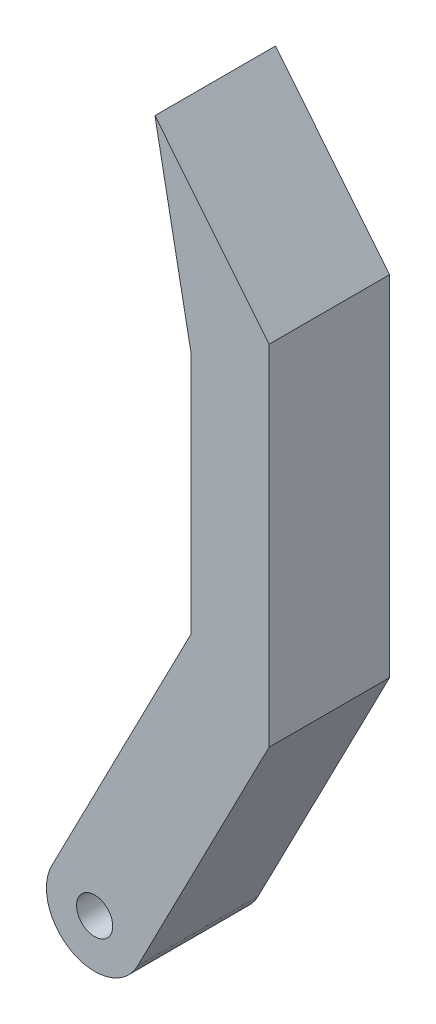
ISO-10303-21;
HEADER;
FILE_DESCRIPTION(('STEP AP214'),'2;1');
FILE_NAME('part.step','',(''),(''),'','','');
FILE_SCHEMA(('AUTOMOTIVE_DESIGN { 1 0 10303 214 1 1 1 1 }'));
ENDSEC;
DATA;
#1=APPLICATION_CONTEXT('core data for automotive mechanical design processes');
#2=APPLICATION_PROTOCOL_DEFINITION('international standard','automotive_design',2000,#1);
#3=PRODUCT_CONTEXT('',#1,'mechanical');
#4=PRODUCT('Part','Part','',(#3));
#5=PRODUCT_RELATED_PRODUCT_CATEGORY('part','',(#4));
#6=PRODUCT_DEFINITION_FORMATION('','',#4);
#7=PRODUCT_DEFINITION_CONTEXT('part definition',#1,'design');
#8=PRODUCT_DEFINITION('design','',#6,#7);
#9=PRODUCT_DEFINITION_SHAPE('','',#8);
#10=(LENGTH_UNIT() NAMED_UNIT(*) SI_UNIT(.MILLI.,.METRE.));
#11=(NAMED_UNIT(*) PLANE_ANGLE_UNIT() SI_UNIT($,.RADIAN.));
#12=(NAMED_UNIT(*) SI_UNIT($,.STERADIAN.) SOLID_ANGLE_UNIT());
#13=UNCERTAINTY_MEASURE_WITH_UNIT(LENGTH_MEASURE(1.E-05),#10,'distance_accuracy_value','');
#14=(GEOMETRIC_REPRESENTATION_CONTEXT(3) GLOBAL_UNCERTAINTY_ASSIGNED_CONTEXT((#13)) GLOBAL_UNIT_ASSIGNED_CONTEXT((#10,
#11,#12)) REPRESENTATION_CONTEXT('',''));
#15=CARTESIAN_POINT('',(0.,0.,0.));
#16=DIRECTION('',(0.,0.,1.));
#17=DIRECTION('',(1.,0.,0.));
#18=AXIS2_PLACEMENT_3D('',#15,#16,#17);
#19=CARTESIAN_POINT('',(-3.55542903671762,1.83273685095957,10.));
#20=DIRECTION('',(-0.888857259179405,0.458184212739893,0.));
#21=DIRECTION('',(-0.458184212739893,-0.888857259179405,0.));
#22=AXIS2_PLACEMENT_3D('',#19,#20,#21);
#23=PLANE('',#22);
#24=DIRECTION('',(0.458184212739893,0.888857259179405,0.));
#25=VECTOR('',#24,1.);
#26=CARTESIAN_POINT('',(-3.55542903671762,1.83273685095957,0.));
#27=LINE('',#26,#25);
#28=CARTESIAN_POINT('',(-3.55542903671762,1.83273685095957,0.));
#29=VERTEX_POINT('',#28);
#30=CARTESIAN_POINT('',(8.00000000000001,24.2497619177961,0.));
#31=VERTEX_POINT('',#30);
#32=EDGE_CURVE('E129',#29,#31,#27,.T.);
#33=ORIENTED_EDGE('',*,*,#32,.F.);
#34=DIRECTION('',(0.,0.,-1.));
#35=VECTOR('',#34,1.);
#36=CARTESIAN_POINT('',(-3.55542903671762,1.83273685095957,10.));
#37=LINE('',#36,#35);
#38=CARTESIAN_POINT('',(-3.55542903671762,1.83273685095957,10.));
#39=VERTEX_POINT('',#38);
#40=EDGE_CURVE('E11',#39,#29,#37,.T.);
#41=ORIENTED_EDGE('',*,*,#40,.F.);
#42=DIRECTION('',(0.458184212739893,0.888857259179405,0.));
#43=VECTOR('',#42,1.);
#44=CARTESIAN_POINT('',(-3.55542903671762,1.83273685095957,10.));
#45=LINE('',#44,#43);
#46=CARTESIAN_POINT('',(8.00000000000001,24.2497619177961,10.));
#47=VERTEX_POINT('',#46);
#48=EDGE_CURVE('E178',#39,#47,#45,.T.);
#49=ORIENTED_EDGE('',*,*,#48,.T.);
#50=DIRECTION('',(0.,0.,-1.));
#51=VECTOR('',#50,1.);
#52=CARTESIAN_POINT('',(8.00000000000001,24.2497619177961,10.));
#53=LINE('',#52,#51);
#54=EDGE_CURVE('E49',#47,#31,#53,.T.);
#55=ORIENTED_EDGE('',*,*,#54,.T.);
#56=EDGE_LOOP('',(#33,#41,#49,#55));
#57=FACE_BOUND('',#56,.T.);
#58=ADVANCED_FACE('F32',(#57),#23,.T.);
#59=CARTESIAN_POINT('',(0.,0.,10.));
#60=DIRECTION('',(0.,0.,-1.));
#61=DIRECTION('',(-1.,0.,0.));
#62=AXIS2_PLACEMENT_3D('',#59,#60,#61);
#63=CYLINDRICAL_SURFACE('',#62,4.);
#64=CARTESIAN_POINT('',(0.,0.,0.));
#65=DIRECTION('',(0.,0.,1.));
#66=DIRECTION('',(1.,0.,0.));
#67=AXIS2_PLACEMENT_3D('',#64,#65,#66);
#68=CIRCLE('',#67,4.);
#69=CARTESIAN_POINT('',(3.55542903671762,-1.83273685095957,0.));
#70=VERTEX_POINT('',#69);
#71=EDGE_CURVE('E131',#29,#70,#68,.T.);
#72=ORIENTED_EDGE('',*,*,#71,.T.);
#73=DIRECTION('',(0.,0.,-1.));
#74=VECTOR('',#73,1.);
#75=CARTESIAN_POINT('',(3.55542903671762,-1.83273685095957,10.));
#76=LINE('',#75,#74);
#77=CARTESIAN_POINT('',(3.55542903671762,-1.83273685095957,10.));
#78=VERTEX_POINT('',#77);
#79=EDGE_CURVE('E41',#78,#70,#76,.T.);
#80=ORIENTED_EDGE('',*,*,#79,.F.);
#81=CARTESIAN_POINT('',(0.,0.,10.));
#82=DIRECTION('',(0.,0.,1.));
#83=DIRECTION('',(1.,0.,0.));
#84=AXIS2_PLACEMENT_3D('',#81,#82,#83);
#85=CIRCLE('',#84,4.);
#86=EDGE_CURVE('E176',#39,#78,#85,.T.);
#87=ORIENTED_EDGE('',*,*,#86,.F.);
#88=ORIENTED_EDGE('',*,*,#40,.T.);
#89=EDGE_LOOP('',(#72,#80,#87,#88));
#90=FACE_BOUND('',#89,.T.);
#91=ADVANCED_FACE('F166',(#90),#63,.T.);
#92=CARTESIAN_POINT('',(-2.11422894103003E-13,-4.10151133441408E-13,10.));
#93=DIRECTION('',(0.458184212739791,0.888857259179458,0.));
#94=DIRECTION('',(-0.888857259179458,0.458184212739791,0.));
#95=AXIS2_PLACEMENT_3D('',#92,#93,#94);
#96=PLANE('',#95);
#97=DIRECTION('',(0.888857259179458,-0.458184212739791,0.));
#98=VECTOR('',#97,1.);
#99=CARTESIAN_POINT('',(-2.11422894103003E-13,-4.10151133441408E-13,0.));
#100=LINE('',#99,#98);
#101=CARTESIAN_POINT('',(3.55462102571887,-1.83232034101996,0.));
#102=VERTEX_POINT('',#101);
#103=EDGE_CURVE('E134',#102,#70,#100,.T.);
#104=ORIENTED_EDGE('',*,*,#103,.F.);
#105=DIRECTION('',(0.,0.,-1.));
#106=VECTOR('',#105,1.);
#107=CARTESIAN_POINT('',(3.55462102571887,-1.83232034101996,10.));
#108=LINE('',#107,#106);
#109=CARTESIAN_POINT('',(3.55462102571887,-1.83232034101996,10.));
#110=VERTEX_POINT('',#109);
#111=EDGE_CURVE('E156',#110,#102,#108,.T.);
#112=ORIENTED_EDGE('',*,*,#111,.F.);
#113=DIRECTION('',(0.888857259179458,-0.458184212739791,0.));
#114=VECTOR('',#113,1.);
#115=CARTESIAN_POINT('',(-2.11422894103003E-13,-4.10151133441408E-13,10.));
#116=LINE('',#115,#114);
#117=EDGE_CURVE('E163',#110,#78,#116,.T.);
#118=ORIENTED_EDGE('',*,*,#117,.T.);
#119=ORIENTED_EDGE('',*,*,#79,.T.);
#120=EDGE_LOOP('',(#104,#112,#118,#119));
#121=FACE_BOUND('',#120,.T.);
#122=ADVANCED_FACE('F161',(#121),#96,.T.);
#123=CARTESIAN_POINT('',(3.55462102571887,-1.83232034101996,10.));
#124=DIRECTION('',(-0.888857259179405,0.458184212739893,0.));
#125=DIRECTION('',(-0.458184212739893,-0.888857259179405,0.));
#126=AXIS2_PLACEMENT_3D('',#123,#124,#125);
#127=PLANE('',#126);
#128=DIRECTION('',(0.458184212739893,0.888857259179405,0.));
#129=VECTOR('',#128,1.);
#130=CARTESIAN_POINT('',(3.55462102571887,-1.83232034101996,0.));
#131=LINE('',#130,#129);
#132=CARTESIAN_POINT('',(14.47,19.3430357018385,0.));
#133=VERTEX_POINT('',#132);
#134=EDGE_CURVE('E137',#102,#133,#131,.T.);
#135=ORIENTED_EDGE('',*,*,#134,.T.);
#136=DIRECTION('',(0.,0.,-1.));
#137=VECTOR('',#136,1.);
#138=CARTESIAN_POINT('',(14.47,19.3430357018385,10.));
#139=LINE('',#138,#137);
#140=CARTESIAN_POINT('',(14.47,19.3430357018385,10.));
#141=VERTEX_POINT('',#140);
#142=EDGE_CURVE('E153',#141,#133,#139,.T.);
#143=ORIENTED_EDGE('',*,*,#142,.F.);
#144=DIRECTION('',(0.458184212739893,0.888857259179405,0.));
#145=VECTOR('',#144,1.);
#146=CARTESIAN_POINT('',(3.55462102571887,-1.83232034101996,10.));
#147=LINE('',#146,#145);
#148=EDGE_CURVE('E174',#110,#141,#147,.T.);
#149=ORIENTED_EDGE('',*,*,#148,.F.);
#150=ORIENTED_EDGE('',*,*,#111,.T.);
#151=EDGE_LOOP('',(#135,#143,#149,#150));
#152=FACE_BOUND('',#151,.T.);
#153=ADVANCED_FACE('F172',(#152),#127,.F.);
#154=CARTESIAN_POINT('',(14.47,0.,10.));
#155=DIRECTION('',(-1.,0.,0.));
#156=DIRECTION('',(0.,0.,1.));
#157=AXIS2_PLACEMENT_3D('',#154,#155,#156);
#158=PLANE('',#157);
#159=DIRECTION('',(0.,1.,0.));
#160=VECTOR('',#159,1.);
#161=CARTESIAN_POINT('',(14.47,0.,0.));
#162=LINE('',#161,#160);
#163=CARTESIAN_POINT('',(14.47,48.3030357018385,0.));
#164=VERTEX_POINT('',#163);
#165=EDGE_CURVE('E140',#133,#164,#162,.T.);
#166=ORIENTED_EDGE('',*,*,#165,.T.);
#167=DIRECTION('',(0.,0.,-1.));
#168=VECTOR('',#167,1.);
#169=CARTESIAN_POINT('',(14.47,48.3030357018385,10.));
#170=LINE('',#169,#168);
#171=CARTESIAN_POINT('',(14.47,48.3030357018385,10.));
#172=VERTEX_POINT('',#171);
#173=EDGE_CURVE('E118',#172,#164,#170,.T.);
#174=ORIENTED_EDGE('',*,*,#173,.F.);
#175=DIRECTION('',(0.,1.,0.));
#176=VECTOR('',#175,1.);
#177=CARTESIAN_POINT('',(14.47,0.,10.));
#178=LINE('',#177,#176);
#179=EDGE_CURVE('E107',#141,#172,#178,.T.);
#180=ORIENTED_EDGE('',*,*,#179,.F.);
#181=ORIENTED_EDGE('',*,*,#142,.T.);
#182=EDGE_LOOP('',(#166,#174,#180,#181));
#183=FACE_BOUND('',#182,.T.);
#184=ADVANCED_FACE('F207',(#183),#158,.F.);
#185=CARTESIAN_POINT('',(32.364419219536,26.1894896839153,10.));
#186=DIRECTION('',(-0.777365588363543,-0.62904907759904,0.));
#187=DIRECTION('',(0.62904907759904,-0.777365588363543,0.));
#188=AXIS2_PLACEMENT_3D('',#185,#186,#187);
#189=PLANE('',#188);
#190=DIRECTION('',(-0.62904907759904,0.777365588363543,0.));
#191=VECTOR('',#190,1.);
#192=CARTESIAN_POINT('',(32.364419219536,26.1894896839153,0.));
#193=LINE('',#192,#191);
#194=CARTESIAN_POINT('',(5.00281138213446,60.0023878067098,0.));
#195=VERTEX_POINT('',#194);
#196=EDGE_CURVE('E115',#164,#195,#193,.T.);
#197=ORIENTED_EDGE('',*,*,#196,.T.);
#198=DIRECTION('',(0.,0.,-1.));
#199=VECTOR('',#198,1.);
#200=CARTESIAN_POINT('',(5.00281138213446,60.0023878067098,10.));
#201=LINE('',#200,#199);
#202=CARTESIAN_POINT('',(5.00281138213446,60.0023878067098,10.));
#203=VERTEX_POINT('',#202);
#204=EDGE_CURVE('E113',#203,#195,#201,.T.);
#205=ORIENTED_EDGE('',*,*,#204,.F.);
#206=DIRECTION('',(-0.62904907759904,0.777365588363543,0.));
#207=VECTOR('',#206,1.);
#208=CARTESIAN_POINT('',(32.364419219536,26.1894896839153,10.));
#209=LINE('',#208,#207);
#210=EDGE_CURVE('E99',#172,#203,#209,.T.);
#211=ORIENTED_EDGE('',*,*,#210,.F.);
#212=ORIENTED_EDGE('',*,*,#173,.T.);
#213=EDGE_LOOP('',(#197,#205,#211,#212));
#214=FACE_BOUND('',#213,.T.);
#215=ADVANCED_FACE('F114',(#214),#189,.F.);
#216=CARTESIAN_POINT('',(15.9566100874892,3.07005689229448,10.));
#217=DIRECTION('',(-0.981989574634544,-0.18893510872537,0.));
#218=DIRECTION('',(0.18893510872537,-0.981989574634544,0.));
#219=AXIS2_PLACEMENT_3D('',#216,#217,#218);
#220=PLANE('',#219);
#221=DIRECTION('',(-0.18893510872537,0.981989574634544,0.));
#222=VECTOR('',#221,1.);
#223=CARTESIAN_POINT('',(15.9566100874892,3.07005689229448,0.));
#224=LINE('',#223,#222);
#225=CARTESIAN_POINT('',(8.,44.4245103237299,0.));
#226=VERTEX_POINT('',#225);
#227=EDGE_CURVE('E144',#226,#195,#224,.T.);
#228=ORIENTED_EDGE('',*,*,#227,.F.);
#229=DIRECTION('',(0.,0.,-1.));
#230=VECTOR('',#229,1.);
#231=CARTESIAN_POINT('',(8.,44.4245103237299,10.));
#232=LINE('',#231,#230);
#233=CARTESIAN_POINT('',(8.,44.4245103237299,10.));
#234=VERTEX_POINT('',#233);
#235=EDGE_CURVE('E74',#234,#226,#232,.T.);
#236=ORIENTED_EDGE('',*,*,#235,.F.);
#237=DIRECTION('',(-0.18893510872537,0.981989574634544,0.));
#238=VECTOR('',#237,1.);
#239=CARTESIAN_POINT('',(15.9566100874892,3.07005689229448,10.));
#240=LINE('',#239,#238);
#241=EDGE_CURVE('E105',#234,#203,#240,.T.);
#242=ORIENTED_EDGE('',*,*,#241,.T.);
#243=ORIENTED_EDGE('',*,*,#204,.T.);
#244=EDGE_LOOP('',(#228,#236,#242,#243));
#245=FACE_BOUND('',#244,.T.);
#246=ADVANCED_FACE('F120',(#245),#220,.T.);
#247=CARTESIAN_POINT('',(0.,0.,10.));
#248=DIRECTION('',(0.,0.,-1.));
#249=DIRECTION('',(-1.,0.,0.));
#250=AXIS2_PLACEMENT_3D('',#247,#248,#249);
#251=CYLINDRICAL_SURFACE('',#250,1.5);
#252=CARTESIAN_POINT('',(0.,0.,10.));
#253=DIRECTION('',(0.,0.,1.));
#254=DIRECTION('',(1.,0.,0.));
#255=AXIS2_PLACEMENT_3D('',#252,#253,#254);
#256=CIRCLE('',#255,1.5);
#257=CARTESIAN_POINT('',(1.5,0.,10.));
#258=VERTEX_POINT('',#257);
#259=EDGE_CURVE('E149',#258,#258,#256,.T.);
#260=ORIENTED_EDGE('',*,*,#259,.T.);
#261=EDGE_LOOP('',(#260));
#262=FACE_BOUND('',#261,.T.);
#263=CARTESIAN_POINT('',(0.,0.,0.));
#264=DIRECTION('',(0.,0.,1.));
#265=DIRECTION('',(1.,0.,0.));
#266=AXIS2_PLACEMENT_3D('',#263,#264,#265);
#267=CIRCLE('',#266,1.5);
#268=CARTESIAN_POINT('',(1.5,0.,0.));
#269=VERTEX_POINT('',#268);
#270=EDGE_CURVE('E126',#269,#269,#267,.T.);
#271=ORIENTED_EDGE('',*,*,#270,.F.);
#272=EDGE_LOOP('',(#271));
#273=FACE_BOUND('',#272,.T.);
#274=ADVANCED_FACE('F34',(#262,#273),#251,.F.);
#275=CARTESIAN_POINT('',(8.00000000000001,0.,10.));
#276=DIRECTION('',(-1.,0.,0.));
#277=DIRECTION('',(0.,-1.,0.));
#278=AXIS2_PLACEMENT_3D('',#275,#276,#277);
#279=PLANE('',#278);
#280=DIRECTION('',(0.,1.,0.));
#281=VECTOR('',#280,1.);
#282=CARTESIAN_POINT('',(8.00000000000001,0.,0.));
#283=LINE('',#282,#281);
#284=EDGE_CURVE('E146',#31,#226,#283,.T.);
#285=ORIENTED_EDGE('',*,*,#284,.F.);
#286=ORIENTED_EDGE('',*,*,#54,.F.);
#287=DIRECTION('',(0.,1.,0.));
#288=VECTOR('',#287,1.);
#289=CARTESIAN_POINT('',(8.00000000000001,0.,10.));
#290=LINE('',#289,#288);
#291=EDGE_CURVE('E121',#47,#234,#290,.T.);
#292=ORIENTED_EDGE('',*,*,#291,.T.);
#293=ORIENTED_EDGE('',*,*,#235,.T.);
#294=EDGE_LOOP('',(#285,#286,#292,#293));
#295=FACE_BOUND('',#294,.T.);
#296=ADVANCED_FACE('F188',(#295),#279,.T.);
#297=CARTESIAN_POINT('',(0.,0.,10.));
#298=DIRECTION('',(0.,0.,1.));
#299=DIRECTION('',(1.,0.,0.));
#300=AXIS2_PLACEMENT_3D('',#297,#298,#299);
#301=PLANE('',#300);
#302=ORIENTED_EDGE('',*,*,#259,.F.);
#303=EDGE_LOOP('',(#302));
#304=FACE_BOUND('',#303,.T.);
#305=ORIENTED_EDGE('',*,*,#48,.F.);
#306=ORIENTED_EDGE('',*,*,#86,.T.);
#307=ORIENTED_EDGE('',*,*,#117,.F.);
#308=ORIENTED_EDGE('',*,*,#148,.T.);
#309=ORIENTED_EDGE('',*,*,#179,.T.);
#310=ORIENTED_EDGE('',*,*,#210,.T.);
#311=ORIENTED_EDGE('',*,*,#241,.F.);
#312=ORIENTED_EDGE('',*,*,#291,.F.);
#313=EDGE_LOOP('',(#305,#306,#307,#308,#309,#310,#311,#312));
#314=FACE_BOUND('',#313,.T.);
#315=ADVANCED_FACE('F102',(#304,#314),#301,.T.);
#316=CARTESIAN_POINT('',(0.,0.,0.));
#317=DIRECTION('',(0.,0.,1.));
#318=DIRECTION('',(1.,0.,0.));
#319=AXIS2_PLACEMENT_3D('',#316,#317,#318);
#320=PLANE('',#319);
#321=ORIENTED_EDGE('',*,*,#270,.T.);
#322=EDGE_LOOP('',(#321));
#323=FACE_BOUND('',#322,.T.);
#324=ORIENTED_EDGE('',*,*,#32,.T.);
#325=ORIENTED_EDGE('',*,*,#284,.T.);
#326=ORIENTED_EDGE('',*,*,#227,.T.);
#327=ORIENTED_EDGE('',*,*,#196,.F.);
#328=ORIENTED_EDGE('',*,*,#165,.F.);
#329=ORIENTED_EDGE('',*,*,#134,.F.);
#330=ORIENTED_EDGE('',*,*,#103,.T.);
#331=ORIENTED_EDGE('',*,*,#71,.F.);
#332=EDGE_LOOP('',(#324,#325,#326,#327,#328,#329,#330,#331));
#333=FACE_BOUND('',#332,.T.);
#334=ADVANCED_FACE('F169',(#323,#333),#320,.F.);
#335=CLOSED_SHELL('',(#58,#91,#122,#153,#184,#215,#246,#274,#296,#315,#334));
#336=MANIFOLD_SOLID_BREP('B2',#335);
#337=ADVANCED_BREP_SHAPE_REPRESENTATION('',(#18,#336),#14);
#338=SHAPE_DEFINITION_REPRESENTATION(#9,#337);
ENDSEC;
END-ISO-10303-21;
